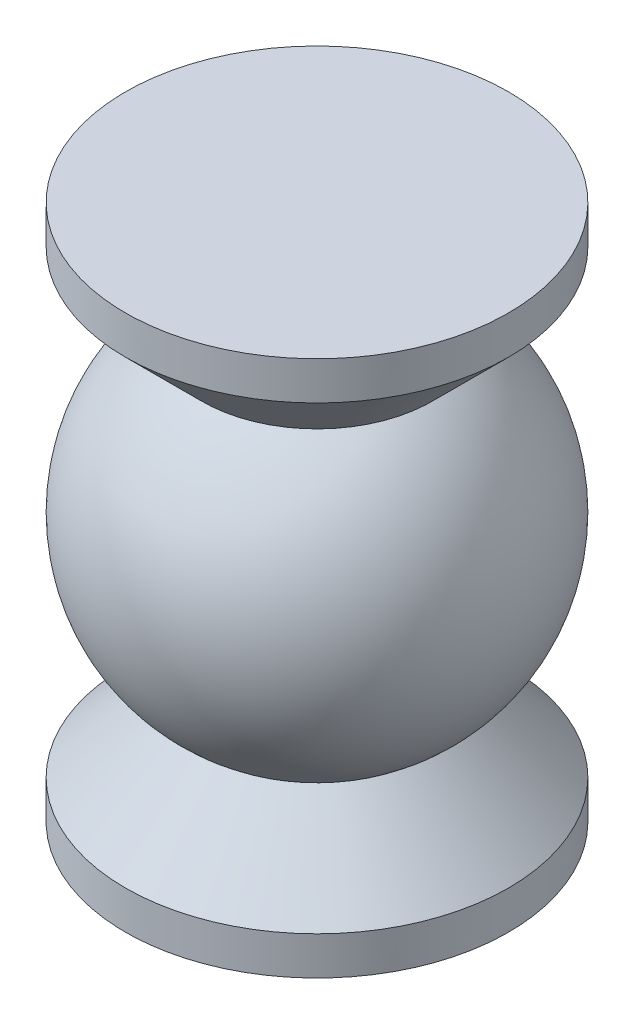
ISO-10303-21;
HEADER;
FILE_DESCRIPTION(('STEP AP214'),'2;1');
FILE_NAME('part.step','',(''),(''),'','','');
FILE_SCHEMA(('AUTOMOTIVE_DESIGN { 1 0 10303 214 1 1 1 1 }'));
ENDSEC;
DATA;
#1=APPLICATION_CONTEXT('core data for automotive mechanical design processes');
#2=APPLICATION_PROTOCOL_DEFINITION('international standard','automotive_design',2000,#1);
#3=PRODUCT_CONTEXT('',#1,'mechanical');
#4=PRODUCT('Part','Part','',(#3));
#5=PRODUCT_RELATED_PRODUCT_CATEGORY('part','',(#4));
#6=PRODUCT_DEFINITION_FORMATION('','',#4);
#7=PRODUCT_DEFINITION_CONTEXT('part definition',#1,'design');
#8=PRODUCT_DEFINITION('design','',#6,#7);
#9=PRODUCT_DEFINITION_SHAPE('','',#8);
#10=(LENGTH_UNIT() NAMED_UNIT(*) SI_UNIT(.MILLI.,.METRE.));
#11=(NAMED_UNIT(*) PLANE_ANGLE_UNIT() SI_UNIT($,.RADIAN.));
#12=(NAMED_UNIT(*) SI_UNIT($,.STERADIAN.) SOLID_ANGLE_UNIT());
#13=UNCERTAINTY_MEASURE_WITH_UNIT(LENGTH_MEASURE(1.E-05),#10,'distance_accuracy_value','');
#14=(GEOMETRIC_REPRESENTATION_CONTEXT(3) GLOBAL_UNCERTAINTY_ASSIGNED_CONTEXT((#13)) GLOBAL_UNIT_ASSIGNED_CONTEXT((#10,
#11,#12)) REPRESENTATION_CONTEXT('',''));
#15=CARTESIAN_POINT('',(0.,0.,0.));
#16=DIRECTION('',(0.,0.,1.));
#17=DIRECTION('',(1.,0.,0.));
#18=AXIS2_PLACEMENT_3D('',#15,#16,#17);
#19=CARTESIAN_POINT('',(0.,35.,0.));
#20=DIRECTION('',(0.,1.,0.));
#21=DIRECTION('',(0.,0.,1.));
#22=AXIS2_PLACEMENT_3D('',#19,#20,#21);
#23=PLANE('',#22);
#24=CARTESIAN_POINT('',(0.,35.,0.));
#25=DIRECTION('',(0.,-1.,0.));
#26=DIRECTION('',(0.,0.,-1.));
#27=AXIS2_PLACEMENT_3D('',#24,#25,#26);
#28=CIRCLE('',#27,25.);
#29=CARTESIAN_POINT('',(0.,35.,-25.));
#30=VERTEX_POINT('',#29);
#31=EDGE_CURVE('E10',#30,#30,#28,.T.);
#32=ORIENTED_EDGE('',*,*,#31,.F.);
#33=EDGE_LOOP('',(#32));
#34=FACE_BOUND('',#33,.T.);
#35=ADVANCED_FACE('F43',(#34),#23,.T.);
#36=CARTESIAN_POINT('',(0.,-20.,0.));
#37=DIRECTION('',(0.,-1.,0.));
#38=DIRECTION('',(0.,0.,-1.));
#39=AXIS2_PLACEMENT_3D('',#36,#37,#38);
#40=CYLINDRICAL_SURFACE('',#39,25.);
#41=ORIENTED_EDGE('',*,*,#31,.T.);
#42=EDGE_LOOP('',(#41));
#43=FACE_BOUND('',#42,.T.);
#44=CARTESIAN_POINT('',(0.,30.,0.));
#45=DIRECTION('',(0.,-1.,0.));
#46=DIRECTION('',(0.,0.,-1.));
#47=AXIS2_PLACEMENT_3D('',#44,#45,#46);
#48=CIRCLE('',#47,25.);
#49=CARTESIAN_POINT('',(0.,30.,-25.));
#50=VERTEX_POINT('',#49);
#51=EDGE_CURVE('E49',#50,#50,#48,.T.);
#52=ORIENTED_EDGE('',*,*,#51,.F.);
#53=EDGE_LOOP('',(#52));
#54=FACE_BOUND('',#53,.T.);
#55=ADVANCED_FACE('F86',(#43,#54),#40,.T.);
#56=CARTESIAN_POINT('',(0.,20.,0.));
#57=DIRECTION('',(0.,1.,0.));
#58=DIRECTION('',(0.,0.,1.));
#59=AXIS2_PLACEMENT_3D('',#56,#57,#58);
#60=CONICAL_SURFACE('',#59,15.,0.785398163397448);
#61=ORIENTED_EDGE('',*,*,#51,.T.);
#62=EDGE_LOOP('',(#61));
#63=FACE_BOUND('',#62,.T.);
#64=CARTESIAN_POINT('',(0.,20.,0.));
#65=DIRECTION('',(0.,-1.,0.));
#66=DIRECTION('',(0.,0.,-1.));
#67=AXIS2_PLACEMENT_3D('',#64,#65,#66);
#68=CIRCLE('',#67,15.);
#69=CARTESIAN_POINT('',(-15.,20.,0.));
#70=VERTEX_POINT('',#69);
#71=EDGE_CURVE('E53',#70,#70,#68,.T.);
#72=ORIENTED_EDGE('',*,*,#71,.F.);
#73=EDGE_LOOP('',(#72));
#74=FACE_BOUND('',#73,.T.);
#75=ADVANCED_FACE('F81',(#63,#74),#60,.T.);
#76=CARTESIAN_POINT('',(0.,0.,0.));
#77=DIRECTION('',(0.,-1.,0.));
#78=DIRECTION('',(-1.,0.,0.));
#79=AXIS2_PLACEMENT_3D('',#76,#77,#78);
#80=SPHERICAL_SURFACE('',#79,25.);
#81=CARTESIAN_POINT('',(0.,-20.,0.));
#82=DIRECTION('',(0.,-1.,0.));
#83=DIRECTION('',(0.,0.,-1.));
#84=AXIS2_PLACEMENT_3D('',#81,#82,#83);
#85=CIRCLE('',#84,15.);
#86=CARTESIAN_POINT('',(-15.,-20.,0.));
#87=VERTEX_POINT('',#86);
#88=EDGE_CURVE('E57',#87,#87,#85,.T.);
#89=CARTESIAN_POINT('',(-15.,-20.,0.));
#90=CARTESIAN_POINT('',(-15.386383877575,-19.7102331585328,0.));
#91=CARTESIAN_POINT('',(-15.764349304277,-19.4092445387064,0.));
#92=CARTESIAN_POINT('',(-16.5022218904126,-18.785891059142,0.));
#93=CARTESIAN_POINT('',(-16.8621290498462,-18.4635261994041,0.));
#94=CARTESIAN_POINT('',(-17.5626637359227,-17.7984875568239,0.));
#95=CARTESIAN_POINT('',(-17.9032912625656,-17.4558137739817,0.));
#96=CARTESIAN_POINT('',(-18.5641263057405,-16.751312031891,0.));
#97=CARTESIAN_POINT('',(-18.8843338222726,-16.3894840726425,0.));
#98=CARTESIAN_POINT('',(-19.5032526836538,-15.6478878896459,0.));
#99=CARTESIAN_POINT('',(-19.8019640285029,-15.2681196658977,0.));
#100=CARTESIAN_POINT('',(-20.3768877346254,-14.4919184892619,0.));
#101=CARTESIAN_POINT('',(-20.6531000958988,-14.0954855363742,0.));
#102=CARTESIAN_POINT('',(-21.1820982609088,-13.2872860261715,0.));
#103=CARTESIAN_POINT('',(-21.4348840646454,-12.8755194688565,0.));
#104=CARTESIAN_POINT('',(-21.9161802896365,-12.0380354631662,0.));
#105=CARTESIAN_POINT('',(-22.1446907108911,-11.6123180147909,0.));
#106=CARTESIAN_POINT('',(-22.5766688391047,-10.748361760207,0.));
#107=CARTESIAN_POINT('',(-22.7801365460637,-10.3101229539983,0.));
#108=CARTESIAN_POINT('',(-23.1613460121235,-9.42259557021363,0.));
#109=CARTESIAN_POINT('',(-23.3390877712243,-8.97330699263761,0.));
#110=CARTESIAN_POINT('',(-23.6682484928968,-8.06518875528102,0.));
#111=CARTESIAN_POINT('',(-23.8196674554685,-7.60635909550044,0.));
#112=CARTESIAN_POINT('',(-24.0956741265362,-6.68069942190651,0.));
#113=CARTESIAN_POINT('',(-24.2202618350321,-6.21386940809315,0.));
#114=CARTESIAN_POINT('',(-24.4421876383544,-5.27377661927491,0.));
#115=CARTESIAN_POINT('',(-24.5395257331807,-4.80051384427003,0.));
#116=CARTESIAN_POINT('',(-24.7066254525011,-3.84914472685123,0.));
#117=CARTESIAN_POINT('',(-24.776387076995,-3.37103838443733,0.));
#118=CARTESIAN_POINT('',(-24.8880995994487,-2.41158759044099,0.));
#119=CARTESIAN_POINT('',(-24.9300504974084,-1.93024313885856,0.));
#120=CARTESIAN_POINT('',(-24.9860006976841,-0.965932458184084,0.));
#121=CARTESIAN_POINT('',(-25.,-0.482966229092043,0.));
#122=CARTESIAN_POINT('',(-25.,0.482966229092038,0.));
#123=CARTESIAN_POINT('',(-24.9860006976841,0.965932458184078,0.));
#124=CARTESIAN_POINT('',(-24.9300504974084,1.93024313885855,0.));
#125=CARTESIAN_POINT('',(-24.8880995994487,2.41158759044098,0.));
#126=CARTESIAN_POINT('',(-24.7763870769951,3.37103838443732,0.));
#127=CARTESIAN_POINT('',(-24.7066254525011,3.84914472685123,0.));
#128=CARTESIAN_POINT('',(-24.5395257331807,4.80051384427002,0.));
#129=CARTESIAN_POINT('',(-24.4421876383544,5.27377661927491,0.));
#130=CARTESIAN_POINT('',(-24.2202618350321,6.21386940809315,0.));
#131=CARTESIAN_POINT('',(-24.0956741265362,6.6806994219065,0.));
#132=CARTESIAN_POINT('',(-23.8196674554685,7.60635909550044,0.));
#133=CARTESIAN_POINT('',(-23.6682484928968,8.06518875528102,0.));
#134=CARTESIAN_POINT('',(-23.3390877712243,8.97330699263761,0.));
#135=CARTESIAN_POINT('',(-23.1613460121235,9.42259557021362,0.));
#136=CARTESIAN_POINT('',(-22.7801365460637,10.3101229539983,0.));
#137=CARTESIAN_POINT('',(-22.5766688391047,10.748361760207,0.));
#138=CARTESIAN_POINT('',(-22.1446907108911,11.6123180147909,0.));
#139=CARTESIAN_POINT('',(-21.9161802896365,12.0380354631662,0.));
#140=CARTESIAN_POINT('',(-21.4348840646454,12.8755194688565,0.));
#141=CARTESIAN_POINT('',(-21.1820982609088,13.2872860261715,0.));
#142=CARTESIAN_POINT('',(-20.6531000958988,14.0954855363742,0.));
#143=CARTESIAN_POINT('',(-20.3768877346254,14.4919184892619,0.));
#144=CARTESIAN_POINT('',(-19.8019640285029,15.2681196658977,0.));
#145=CARTESIAN_POINT('',(-19.5032526836538,15.6478878896459,0.));
#146=CARTESIAN_POINT('',(-18.8843338222726,16.3894840726425,0.));
#147=CARTESIAN_POINT('',(-18.5641263057405,16.751312031891,0.));
#148=CARTESIAN_POINT('',(-17.9032912625656,17.4558137739817,0.));
#149=CARTESIAN_POINT('',(-17.5626637359227,17.7984875568239,0.));
#150=CARTESIAN_POINT('',(-16.8621290498462,18.4635261994041,0.));
#151=CARTESIAN_POINT('',(-16.5022218904126,18.785891059142,0.));
#152=CARTESIAN_POINT('',(-15.764349304277,19.4092445387064,0.));
#153=CARTESIAN_POINT('',(-15.386383877575,19.7102331585328,0.));
#154=CARTESIAN_POINT('',(-15.,20.,0.));
#155=B_SPLINE_CURVE_WITH_KNOTS('',3,(#89,#90,#91,#92,#93,#94,#95,#96,#97,#98,#99,#100,#101,#102,
#103,#104,#105,#106,#107,#108,#109,#110,#111,#112,#113,#114,#115,#116,#117,#118,#119,#120,#121,
#122,#123,#124,#125,#126,#127,#128,#129,#130,#131,#132,#133,#134,#135,#136,#137,#138,#139,#140,
#141,#142,#143,#144,#145,#146,#147,#148,#149,#150,#151,#152,#153,#154),.UNSPECIFIED.,.F.,.F.,(4,
2,2,2,2,2,2,2,2,2,2,2,2,2,2,2,2,2,2,2,2,2,2,2,2,2,2,2,2,2,2,2,4),(0.,1.4486960076868,
2.8973920153736,4.34608802306039,5.79478403074719,7.24348003843399,8.69217604612078,
10.1408720538076,11.5895680614944,13.0382640691812,14.486960076868,15.9356560845548,
17.3843520922416,18.8330480999284,20.2817441076152,21.730440115302,23.1791361229887,
24.6278321306755,26.0765281383623,27.5252241460491,28.9739201537359,30.4226161614227,
31.8713121691095,33.3200081767963,34.7687041844831,36.2174001921699,37.6660961998567,
39.1147922075435,40.5634882152303,42.0121842229171,43.4608802306039,44.9095762382907,
46.3582722459775),.UNSPECIFIED.);
#156=EDGE_CURVE('BSEAM77',#87,#70,#155,.T.);
#157=ORIENTED_EDGE('',*,*,#88,.F.);
#158=ORIENTED_EDGE('',*,*,#71,.T.);
#159=ORIENTED_EDGE('',*,*,#156,.T.);
#160=ORIENTED_EDGE('',*,*,#156,.F.);
#161=EDGE_LOOP('',(#157,#159,#158,#160));
#162=FACE_BOUND('',#161,.T.);
#163=ADVANCED_FACE('F77',(#162),#80,.T.);
#164=CARTESIAN_POINT('',(0.,-35.,0.));
#165=DIRECTION('',(0.,-1.,0.));
#166=DIRECTION('',(0.,0.,1.));
#167=AXIS2_PLACEMENT_3D('',#164,#165,#166);
#168=PLANE('',#167);
#169=CARTESIAN_POINT('',(0.,-35.,0.));
#170=DIRECTION('',(0.,-1.,0.));
#171=DIRECTION('',(0.,0.,-1.));
#172=AXIS2_PLACEMENT_3D('',#169,#170,#171);
#173=CIRCLE('',#172,25.);
#174=CARTESIAN_POINT('',(0.,-35.,-25.));
#175=VERTEX_POINT('',#174);
#176=EDGE_CURVE('E62',#175,#175,#173,.T.);
#177=ORIENTED_EDGE('',*,*,#176,.T.);
#178=EDGE_LOOP('',(#177));
#179=FACE_BOUND('',#178,.T.);
#180=ADVANCED_FACE('F80',(#179),#168,.T.);
#181=CARTESIAN_POINT('',(0.,20.,0.));
#182=DIRECTION('',(0.,1.,0.));
#183=DIRECTION('',(0.,0.,-1.));
#184=AXIS2_PLACEMENT_3D('',#181,#182,#183);
#185=CYLINDRICAL_SURFACE('',#184,25.);
#186=ORIENTED_EDGE('',*,*,#176,.F.);
#187=EDGE_LOOP('',(#186));
#188=FACE_BOUND('',#187,.T.);
#189=CARTESIAN_POINT('',(0.,-30.,0.));
#190=DIRECTION('',(0.,-1.,0.));
#191=DIRECTION('',(0.,0.,-1.));
#192=AXIS2_PLACEMENT_3D('',#189,#190,#191);
#193=CIRCLE('',#192,25.);
#194=CARTESIAN_POINT('',(0.,-30.,-25.));
#195=VERTEX_POINT('',#194);
#196=EDGE_CURVE('E65',#195,#195,#193,.T.);
#197=ORIENTED_EDGE('',*,*,#196,.T.);
#198=EDGE_LOOP('',(#197));
#199=FACE_BOUND('',#198,.T.);
#200=ADVANCED_FACE('F69',(#188,#199),#185,.T.);
#201=CARTESIAN_POINT('',(0.,-20.,0.));
#202=DIRECTION('',(0.,-1.,0.));
#203=DIRECTION('',(0.,0.,1.));
#204=AXIS2_PLACEMENT_3D('',#201,#202,#203);
#205=CONICAL_SURFACE('',#204,15.,0.785398163397448);
#206=ORIENTED_EDGE('',*,*,#196,.F.);
#207=EDGE_LOOP('',(#206));
#208=FACE_BOUND('',#207,.T.);
#209=ORIENTED_EDGE('',*,*,#88,.T.);
#210=EDGE_LOOP('',(#209));
#211=FACE_BOUND('',#210,.T.);
#212=ADVANCED_FACE('F71',(#208,#211),#205,.T.);
#213=CLOSED_SHELL('',(#35,#55,#75,#163,#180,#200,#212));
#214=MANIFOLD_SOLID_BREP('B2',#213);
#215=ADVANCED_BREP_SHAPE_REPRESENTATION('',(#18,#214),#14);
#216=SHAPE_DEFINITION_REPRESENTATION(#9,#215);
ENDSEC;
END-ISO-10303-21;
